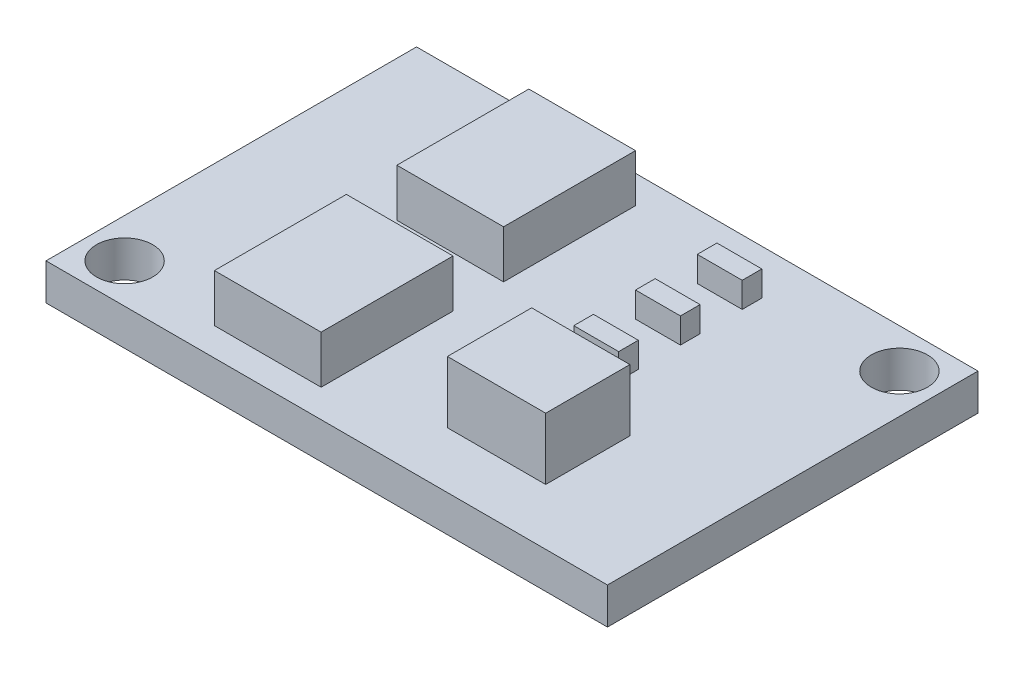
ISO-10303-21;
HEADER;
FILE_DESCRIPTION(('STEP AP214'),'2;1');
FILE_NAME('part.step','',(''),(''),'','','');
FILE_SCHEMA(('AUTOMOTIVE_DESIGN { 1 0 10303 214 1 1 1 1 }'));
ENDSEC;
DATA;
#1=APPLICATION_CONTEXT('core data for automotive mechanical design processes');
#2=APPLICATION_PROTOCOL_DEFINITION('international standard','automotive_design',2000,#1);
#3=PRODUCT_CONTEXT('',#1,'mechanical');
#4=PRODUCT('Part','Part','',(#3));
#5=PRODUCT_RELATED_PRODUCT_CATEGORY('part','',(#4));
#6=PRODUCT_DEFINITION_FORMATION('','',#4);
#7=PRODUCT_DEFINITION_CONTEXT('part definition',#1,'design');
#8=PRODUCT_DEFINITION('design','',#6,#7);
#9=PRODUCT_DEFINITION_SHAPE('','',#8);
#10=(LENGTH_UNIT() NAMED_UNIT(*) SI_UNIT(.MILLI.,.METRE.));
#11=(NAMED_UNIT(*) PLANE_ANGLE_UNIT() SI_UNIT($,.RADIAN.));
#12=(NAMED_UNIT(*) SI_UNIT($,.STERADIAN.) SOLID_ANGLE_UNIT());
#13=UNCERTAINTY_MEASURE_WITH_UNIT(LENGTH_MEASURE(1.E-05),#10,'distance_accuracy_value','');
#14=(GEOMETRIC_REPRESENTATION_CONTEXT(3) GLOBAL_UNCERTAINTY_ASSIGNED_CONTEXT((#13)) GLOBAL_UNIT_ASSIGNED_CONTEXT((#10,
#11,#12)) REPRESENTATION_CONTEXT('',''));
#15=CARTESIAN_POINT('',(0.,0.,0.));
#16=DIRECTION('',(0.,0.,1.));
#17=DIRECTION('',(1.,0.,0.));
#18=AXIS2_PLACEMENT_3D('',#15,#16,#17);
#19=CARTESIAN_POINT('',(0.,1.3,0.));
#20=DIRECTION('',(0.,1.,0.));
#21=DIRECTION('',(0.,0.,1.));
#22=AXIS2_PLACEMENT_3D('',#19,#20,#21);
#23=PLANE('',#22);
#24=DIRECTION('',(-1.,0.,0.));
#25=VECTOR('',#24,1.);
#26=CARTESIAN_POINT('',(0.,1.3,0.900000000000002));
#27=LINE('',#26,#25);
#28=CARTESIAN_POINT('',(-1.2,1.3,0.900000000000002));
#29=VERTEX_POINT('',#28);
#30=CARTESIAN_POINT('',(-5.,1.3,0.900000000000001));
#31=VERTEX_POINT('',#30);
#32=EDGE_CURVE('E408',#29,#31,#27,.T.);
#33=ORIENTED_EDGE('',*,*,#32,.F.);
#34=DIRECTION('',(0.,0.,-1.));
#35=VECTOR('',#34,1.);
#36=CARTESIAN_POINT('',(-1.2,1.3,0.));
#37=LINE('',#36,#35);
#38=CARTESIAN_POINT('',(-1.2,1.3,5.6));
#39=VERTEX_POINT('',#38);
#40=EDGE_CURVE('E401',#39,#29,#37,.T.);
#41=ORIENTED_EDGE('',*,*,#40,.F.);
#42=DIRECTION('',(-1.,0.,0.));
#43=VECTOR('',#42,1.);
#44=CARTESIAN_POINT('',(0.,1.3,5.6));
#45=LINE('',#44,#43);
#46=CARTESIAN_POINT('',(-5.,1.3,5.6));
#47=VERTEX_POINT('',#46);
#48=EDGE_CURVE('E404',#39,#47,#45,.T.);
#49=ORIENTED_EDGE('',*,*,#48,.T.);
#50=DIRECTION('',(0.,0.,-1.));
#51=VECTOR('',#50,1.);
#52=CARTESIAN_POINT('',(-5.,1.3,0.));
#53=LINE('',#52,#51);
#54=EDGE_CURVE('E406',#47,#31,#53,.T.);
#55=ORIENTED_EDGE('',*,*,#54,.T.);
#56=EDGE_LOOP('',(#33,#41,#49,#55));
#57=FACE_BOUND('',#56,.T.);
#58=DIRECTION('',(-1.,0.,0.));
#59=VECTOR('',#58,1.);
#60=CARTESIAN_POINT('',(0.,1.3,-5.6));
#61=LINE('',#60,#59);
#62=CARTESIAN_POINT('',(-1.2,1.3,-5.6));
#63=VERTEX_POINT('',#62);
#64=CARTESIAN_POINT('',(-5.,1.3,-5.6));
#65=VERTEX_POINT('',#64);
#66=EDGE_CURVE('E440',#63,#65,#61,.T.);
#67=ORIENTED_EDGE('',*,*,#66,.F.);
#68=DIRECTION('',(0.,0.,-1.));
#69=VECTOR('',#68,1.);
#70=CARTESIAN_POINT('',(-1.2,1.3,0.));
#71=LINE('',#70,#69);
#72=CARTESIAN_POINT('',(-1.2,1.3,-0.899999999999998));
#73=VERTEX_POINT('',#72);
#74=EDGE_CURVE('E425',#73,#63,#71,.T.);
#75=ORIENTED_EDGE('',*,*,#74,.F.);
#76=DIRECTION('',(-1.,0.,0.));
#77=VECTOR('',#76,1.);
#78=CARTESIAN_POINT('',(0.,1.3,-0.899999999999998));
#79=LINE('',#78,#77);
#80=CARTESIAN_POINT('',(-5.,1.3,-0.899999999999998));
#81=VERTEX_POINT('',#80);
#82=EDGE_CURVE('E436',#73,#81,#79,.T.);
#83=ORIENTED_EDGE('',*,*,#82,.T.);
#84=DIRECTION('',(0.,0.,-1.));
#85=VECTOR('',#84,1.);
#86=CARTESIAN_POINT('',(-5.,1.3,0.));
#87=LINE('',#86,#85);
#88=EDGE_CURVE('E438',#81,#65,#87,.T.);
#89=ORIENTED_EDGE('',*,*,#88,.T.);
#90=EDGE_LOOP('',(#67,#75,#83,#89));
#91=FACE_BOUND('',#90,.T.);
#92=CARTESIAN_POINT('',(8.6,1.3,-5.2));
#93=DIRECTION('',(0.,1.,0.));
#94=DIRECTION('',(0.,0.,1.));
#95=AXIS2_PLACEMENT_3D('',#92,#93,#94);
#96=CIRCLE('',#95,0.999999999999998);
#97=CARTESIAN_POINT('',(8.6,1.3,-4.2));
#98=VERTEX_POINT('',#97);
#99=EDGE_CURVE('E450',#98,#98,#96,.T.);
#100=ORIENTED_EDGE('',*,*,#99,.F.);
#101=EDGE_LOOP('',(#100));
#102=FACE_BOUND('',#101,.T.);
#103=DIRECTION('',(0.,0.,1.));
#104=VECTOR('',#103,1.);
#105=CARTESIAN_POINT('',(-10.,1.3,-6.6));
#106=LINE('',#105,#104);
#107=CARTESIAN_POINT('',(-10.,1.3,-6.6));
#108=VERTEX_POINT('',#107);
#109=CARTESIAN_POINT('',(-10.,1.3,6.6));
#110=VERTEX_POINT('',#109);
#111=EDGE_CURVE('E456',#108,#110,#106,.T.);
#112=ORIENTED_EDGE('',*,*,#111,.T.);
#113=DIRECTION('',(1.,0.,0.));
#114=VECTOR('',#113,1.);
#115=CARTESIAN_POINT('',(-10.,1.3,6.6));
#116=LINE('',#115,#114);
#117=CARTESIAN_POINT('',(10.,1.3,6.6));
#118=VERTEX_POINT('',#117);
#119=EDGE_CURVE('E459',#110,#118,#116,.T.);
#120=ORIENTED_EDGE('',*,*,#119,.T.);
#121=DIRECTION('',(0.,0.,1.));
#122=VECTOR('',#121,1.);
#123=CARTESIAN_POINT('',(10.,1.3,-6.6));
#124=LINE('',#123,#122);
#125=CARTESIAN_POINT('',(10.,1.3,-6.6));
#126=VERTEX_POINT('',#125);
#127=EDGE_CURVE('E462',#126,#118,#124,.T.);
#128=ORIENTED_EDGE('',*,*,#127,.F.);
#129=DIRECTION('',(1.,0.,0.));
#130=VECTOR('',#129,1.);
#131=CARTESIAN_POINT('',(-10.,1.3,-6.6));
#132=LINE('',#131,#130);
#133=EDGE_CURVE('E465',#108,#126,#132,.T.);
#134=ORIENTED_EDGE('',*,*,#133,.F.);
#135=EDGE_LOOP('',(#112,#120,#128,#134));
#136=FACE_BOUND('',#135,.T.);
#137=CARTESIAN_POINT('',(-8.6,1.3,5.2));
#138=DIRECTION('',(0.,1.,0.));
#139=DIRECTION('',(0.,0.,1.));
#140=AXIS2_PLACEMENT_3D('',#137,#138,#139);
#141=CIRCLE('',#140,0.999999999999998);
#142=CARTESIAN_POINT('',(-8.6,1.3,6.2));
#143=VERTEX_POINT('',#142);
#144=EDGE_CURVE('E444',#143,#143,#141,.T.);
#145=ORIENTED_EDGE('',*,*,#144,.F.);
#146=EDGE_LOOP('',(#145));
#147=FACE_BOUND('',#146,.T.);
#148=DIRECTION('',(-1.,0.,0.));
#149=VECTOR('',#148,1.);
#150=CARTESIAN_POINT('',(0.,1.3,-4.3));
#151=LINE('',#150,#149);
#152=CARTESIAN_POINT('',(3.9,1.3,-4.3));
#153=VERTEX_POINT('',#152);
#154=CARTESIAN_POINT('',(2.3,1.3,-4.3));
#155=VERTEX_POINT('',#154);
#156=EDGE_CURVE('E375',#153,#155,#151,.T.);
#157=ORIENTED_EDGE('',*,*,#156,.T.);
#158=DIRECTION('',(0.,0.,-1.));
#159=VECTOR('',#158,1.);
#160=CARTESIAN_POINT('',(2.3,1.3,0.));
#161=LINE('',#160,#159);
#162=CARTESIAN_POINT('',(2.3,1.3,-5.));
#163=VERTEX_POINT('',#162);
#164=EDGE_CURVE('E377',#155,#163,#161,.T.);
#165=ORIENTED_EDGE('',*,*,#164,.T.);
#166=DIRECTION('',(-1.,0.,0.));
#167=VECTOR('',#166,1.);
#168=CARTESIAN_POINT('',(0.,1.3,-5.));
#169=LINE('',#168,#167);
#170=CARTESIAN_POINT('',(3.9,1.3,-5.));
#171=VERTEX_POINT('',#170);
#172=EDGE_CURVE('E369',#171,#163,#169,.T.);
#173=ORIENTED_EDGE('',*,*,#172,.F.);
#174=DIRECTION('',(0.,0.,-1.));
#175=VECTOR('',#174,1.);
#176=CARTESIAN_POINT('',(3.9,1.3,0.));
#177=LINE('',#176,#175);
#178=EDGE_CURVE('E372',#153,#171,#177,.T.);
#179=ORIENTED_EDGE('',*,*,#178,.F.);
#180=EDGE_LOOP('',(#157,#165,#173,#179));
#181=FACE_BOUND('',#180,.T.);
#182=DIRECTION('',(-1.,0.,0.));
#183=VECTOR('',#182,1.);
#184=CARTESIAN_POINT('',(0.,1.3,-2.1));
#185=LINE('',#184,#183);
#186=CARTESIAN_POINT('',(3.9,1.3,-2.1));
#187=VERTEX_POINT('',#186);
#188=CARTESIAN_POINT('',(2.3,1.3,-2.1));
#189=VERTEX_POINT('',#188);
#190=EDGE_CURVE('E342',#187,#189,#185,.T.);
#191=ORIENTED_EDGE('',*,*,#190,.T.);
#192=DIRECTION('',(0.,0.,-1.));
#193=VECTOR('',#192,1.);
#194=CARTESIAN_POINT('',(2.3,1.3,0.));
#195=LINE('',#194,#193);
#196=CARTESIAN_POINT('',(2.3,1.3,-2.8));
#197=VERTEX_POINT('',#196);
#198=EDGE_CURVE('E344',#189,#197,#195,.T.);
#199=ORIENTED_EDGE('',*,*,#198,.T.);
#200=DIRECTION('',(-1.,0.,0.));
#201=VECTOR('',#200,1.);
#202=CARTESIAN_POINT('',(0.,1.3,-2.8));
#203=LINE('',#202,#201);
#204=CARTESIAN_POINT('',(3.9,1.3,-2.8));
#205=VERTEX_POINT('',#204);
#206=EDGE_CURVE('E336',#205,#197,#203,.T.);
#207=ORIENTED_EDGE('',*,*,#206,.F.);
#208=DIRECTION('',(0.,0.,-1.));
#209=VECTOR('',#208,1.);
#210=CARTESIAN_POINT('',(3.9,1.3,0.));
#211=LINE('',#210,#209);
#212=EDGE_CURVE('E339',#187,#205,#211,.T.);
#213=ORIENTED_EDGE('',*,*,#212,.F.);
#214=EDGE_LOOP('',(#191,#199,#207,#213));
#215=FACE_BOUND('',#214,.T.);
#216=DIRECTION('',(-1.,0.,0.));
#217=VECTOR('',#216,1.);
#218=CARTESIAN_POINT('',(0.,1.3,0.100000000000001));
#219=LINE('',#218,#217);
#220=CARTESIAN_POINT('',(3.9,1.3,0.100000000000002));
#221=VERTEX_POINT('',#220);
#222=CARTESIAN_POINT('',(2.3,1.3,0.100000000000002));
#223=VERTEX_POINT('',#222);
#224=EDGE_CURVE('E309',#221,#223,#219,.T.);
#225=ORIENTED_EDGE('',*,*,#224,.T.);
#226=DIRECTION('',(0.,0.,-1.));
#227=VECTOR('',#226,1.);
#228=CARTESIAN_POINT('',(2.3,1.3,0.));
#229=LINE('',#228,#227);
#230=CARTESIAN_POINT('',(2.3,1.3,-0.599999999999998));
#231=VERTEX_POINT('',#230);
#232=EDGE_CURVE('E311',#223,#231,#229,.T.);
#233=ORIENTED_EDGE('',*,*,#232,.T.);
#234=DIRECTION('',(-1.,0.,0.));
#235=VECTOR('',#234,1.);
#236=CARTESIAN_POINT('',(0.,1.3,-0.599999999999998));
#237=LINE('',#236,#235);
#238=CARTESIAN_POINT('',(3.9,1.3,-0.599999999999998));
#239=VERTEX_POINT('',#238);
#240=EDGE_CURVE('E303',#239,#231,#237,.T.);
#241=ORIENTED_EDGE('',*,*,#240,.F.);
#242=DIRECTION('',(0.,0.,-1.));
#243=VECTOR('',#242,1.);
#244=CARTESIAN_POINT('',(3.9,1.3,0.));
#245=LINE('',#244,#243);
#246=EDGE_CURVE('E306',#221,#239,#245,.T.);
#247=ORIENTED_EDGE('',*,*,#246,.F.);
#248=EDGE_LOOP('',(#225,#233,#241,#247));
#249=FACE_BOUND('',#248,.T.);
#250=DIRECTION('',(-1.,0.,0.));
#251=VECTOR('',#250,1.);
#252=CARTESIAN_POINT('',(0.,1.3,4.6));
#253=LINE('',#252,#251);
#254=CARTESIAN_POINT('',(5.8,1.3,4.6));
#255=VERTEX_POINT('',#254);
#256=CARTESIAN_POINT('',(2.3,1.3,4.6));
#257=VERTEX_POINT('',#256);
#258=EDGE_CURVE('E78',#255,#257,#253,.T.);
#259=ORIENTED_EDGE('',*,*,#258,.T.);
#260=DIRECTION('',(0.,0.,-1.));
#261=VECTOR('',#260,1.);
#262=CARTESIAN_POINT('',(2.3,1.3,0.));
#263=LINE('',#262,#261);
#264=CARTESIAN_POINT('',(2.3,1.3,1.6));
#265=VERTEX_POINT('',#264);
#266=EDGE_CURVE('E268',#257,#265,#263,.T.);
#267=ORIENTED_EDGE('',*,*,#266,.T.);
#268=DIRECTION('',(-1.,0.,0.));
#269=VECTOR('',#268,1.);
#270=CARTESIAN_POINT('',(0.,1.3,1.6));
#271=LINE('',#270,#269);
#272=CARTESIAN_POINT('',(5.8,1.3,1.6));
#273=VERTEX_POINT('',#272);
#274=EDGE_CURVE('E269',#273,#265,#271,.T.);
#275=ORIENTED_EDGE('',*,*,#274,.F.);
#276=DIRECTION('',(0.,0.,-1.));
#277=VECTOR('',#276,1.);
#278=CARTESIAN_POINT('',(5.8,1.3,0.));
#279=LINE('',#278,#277);
#280=EDGE_CURVE('E83',#255,#273,#279,.T.);
#281=ORIENTED_EDGE('',*,*,#280,.F.);
#282=EDGE_LOOP('',(#259,#267,#275,#281));
#283=FACE_BOUND('',#282,.T.);
#284=ADVANCED_FACE('F63',(#57,#91,#102,#136,#147,#181,#215,#249,#283),#23,.T.);
#285=CARTESIAN_POINT('',(0.,0.,0.));
#286=DIRECTION('',(0.,1.,0.));
#287=DIRECTION('',(0.,0.,1.));
#288=AXIS2_PLACEMENT_3D('',#285,#286,#287);
#289=PLANE('',#288);
#290=DIRECTION('',(0.,0.,1.));
#291=VECTOR('',#290,1.);
#292=CARTESIAN_POINT('',(-10.,0.,-6.6));
#293=LINE('',#292,#291);
#294=CARTESIAN_POINT('',(-10.,0.,-6.6));
#295=VERTEX_POINT('',#294);
#296=CARTESIAN_POINT('',(-10.,0.,6.6));
#297=VERTEX_POINT('',#296);
#298=EDGE_CURVE('E453',#295,#297,#293,.T.);
#299=ORIENTED_EDGE('',*,*,#298,.F.);
#300=DIRECTION('',(1.,0.,0.));
#301=VECTOR('',#300,1.);
#302=CARTESIAN_POINT('',(-10.,0.,-6.6));
#303=LINE('',#302,#301);
#304=CARTESIAN_POINT('',(10.,0.,-6.6));
#305=VERTEX_POINT('',#304);
#306=EDGE_CURVE('E460',#295,#305,#303,.T.);
#307=ORIENTED_EDGE('',*,*,#306,.T.);
#308=DIRECTION('',(0.,0.,1.));
#309=VECTOR('',#308,1.);
#310=CARTESIAN_POINT('',(10.,0.,-6.6));
#311=LINE('',#310,#309);
#312=CARTESIAN_POINT('',(10.,0.,6.6));
#313=VERTEX_POINT('',#312);
#314=EDGE_CURVE('E474',#305,#313,#311,.T.);
#315=ORIENTED_EDGE('',*,*,#314,.T.);
#316=DIRECTION('',(1.,0.,0.));
#317=VECTOR('',#316,1.);
#318=CARTESIAN_POINT('',(-10.,0.,6.6));
#319=LINE('',#318,#317);
#320=EDGE_CURVE('E471',#297,#313,#319,.T.);
#321=ORIENTED_EDGE('',*,*,#320,.F.);
#322=EDGE_LOOP('',(#299,#307,#315,#321));
#323=FACE_BOUND('',#322,.T.);
#324=CARTESIAN_POINT('',(8.6,0.,-5.2));
#325=DIRECTION('',(0.,1.,0.));
#326=DIRECTION('',(0.,0.,1.));
#327=AXIS2_PLACEMENT_3D('',#324,#325,#326);
#328=CIRCLE('',#327,0.999999999999998);
#329=CARTESIAN_POINT('',(8.6,0.,-4.2));
#330=VERTEX_POINT('',#329);
#331=EDGE_CURVE('E447',#330,#330,#328,.T.);
#332=ORIENTED_EDGE('',*,*,#331,.T.);
#333=EDGE_LOOP('',(#332));
#334=FACE_BOUND('',#333,.T.);
#335=CARTESIAN_POINT('',(-8.6,0.,5.2));
#336=DIRECTION('',(0.,1.,0.));
#337=DIRECTION('',(0.,0.,1.));
#338=AXIS2_PLACEMENT_3D('',#335,#336,#337);
#339=CIRCLE('',#338,0.999999999999998);
#340=CARTESIAN_POINT('',(-8.6,0.,6.2));
#341=VERTEX_POINT('',#340);
#342=EDGE_CURVE('E443',#341,#341,#339,.T.);
#343=ORIENTED_EDGE('',*,*,#342,.T.);
#344=EDGE_LOOP('',(#343));
#345=FACE_BOUND('',#344,.T.);
#346=ADVANCED_FACE('F491',(#323,#334,#345),#289,.F.);
#347=CARTESIAN_POINT('',(-10.,1.3,-6.6));
#348=DIRECTION('',(1.,0.,0.));
#349=DIRECTION('',(0.,0.,-1.));
#350=AXIS2_PLACEMENT_3D('',#347,#348,#349);
#351=PLANE('',#350);
#352=ORIENTED_EDGE('',*,*,#298,.T.);
#353=DIRECTION('',(0.,-1.,0.));
#354=VECTOR('',#353,1.);
#355=CARTESIAN_POINT('',(-10.,1.3,6.6));
#356=LINE('',#355,#354);
#357=EDGE_CURVE('E12',#110,#297,#356,.T.);
#358=ORIENTED_EDGE('',*,*,#357,.F.);
#359=ORIENTED_EDGE('',*,*,#111,.F.);
#360=DIRECTION('',(0.,-1.,0.));
#361=VECTOR('',#360,1.);
#362=CARTESIAN_POINT('',(-10.,1.3,-6.6));
#363=LINE('',#362,#361);
#364=EDGE_CURVE('E468',#108,#295,#363,.T.);
#365=ORIENTED_EDGE('',*,*,#364,.T.);
#366=EDGE_LOOP('',(#352,#358,#359,#365));
#367=FACE_BOUND('',#366,.T.);
#368=ADVANCED_FACE('F65',(#367),#351,.F.);
#369=CARTESIAN_POINT('',(-10.,1.3,6.6));
#370=DIRECTION('',(0.,0.,-1.));
#371=DIRECTION('',(-1.,0.,0.));
#372=AXIS2_PLACEMENT_3D('',#369,#370,#371);
#373=PLANE('',#372);
#374=ORIENTED_EDGE('',*,*,#320,.T.);
#375=DIRECTION('',(0.,-1.,0.));
#376=VECTOR('',#375,1.);
#377=CARTESIAN_POINT('',(10.,1.3,6.6));
#378=LINE('',#377,#376);
#379=EDGE_CURVE('E71',#118,#313,#378,.T.);
#380=ORIENTED_EDGE('',*,*,#379,.F.);
#381=ORIENTED_EDGE('',*,*,#119,.F.);
#382=ORIENTED_EDGE('',*,*,#357,.T.);
#383=EDGE_LOOP('',(#374,#380,#381,#382));
#384=FACE_BOUND('',#383,.T.);
#385=ADVANCED_FACE('F487',(#384),#373,.F.);
#386=CARTESIAN_POINT('',(10.,1.3,-6.6));
#387=DIRECTION('',(1.,0.,0.));
#388=DIRECTION('',(0.,0.,-1.));
#389=AXIS2_PLACEMENT_3D('',#386,#387,#388);
#390=PLANE('',#389);
#391=ORIENTED_EDGE('',*,*,#314,.F.);
#392=DIRECTION('',(0.,-1.,0.));
#393=VECTOR('',#392,1.);
#394=CARTESIAN_POINT('',(10.,1.3,-6.6));
#395=LINE('',#394,#393);
#396=EDGE_CURVE('E480',#126,#305,#395,.T.);
#397=ORIENTED_EDGE('',*,*,#396,.F.);
#398=ORIENTED_EDGE('',*,*,#127,.T.);
#399=ORIENTED_EDGE('',*,*,#379,.T.);
#400=EDGE_LOOP('',(#391,#397,#398,#399));
#401=FACE_BOUND('',#400,.T.);
#402=ADVANCED_FACE('F484',(#401),#390,.T.);
#403=CARTESIAN_POINT('',(-10.,1.3,-6.6));
#404=DIRECTION('',(0.,0.,-1.));
#405=DIRECTION('',(-1.,0.,0.));
#406=AXIS2_PLACEMENT_3D('',#403,#404,#405);
#407=PLANE('',#406);
#408=ORIENTED_EDGE('',*,*,#306,.F.);
#409=ORIENTED_EDGE('',*,*,#364,.F.);
#410=ORIENTED_EDGE('',*,*,#133,.T.);
#411=ORIENTED_EDGE('',*,*,#396,.T.);
#412=EDGE_LOOP('',(#408,#409,#410,#411));
#413=FACE_BOUND('',#412,.T.);
#414=ADVANCED_FACE('F495',(#413),#407,.T.);
#415=CARTESIAN_POINT('',(8.6,1.3,-5.2));
#416=DIRECTION('',(0.,-1.,0.));
#417=DIRECTION('',(0.,0.,-1.));
#418=AXIS2_PLACEMENT_3D('',#415,#416,#417);
#419=CYLINDRICAL_SURFACE('',#418,0.999999999999998);
#420=ORIENTED_EDGE('',*,*,#99,.T.);
#421=EDGE_LOOP('',(#420));
#422=FACE_BOUND('',#421,.T.);
#423=ORIENTED_EDGE('',*,*,#331,.F.);
#424=EDGE_LOOP('',(#423));
#425=FACE_BOUND('',#424,.T.);
#426=ADVANCED_FACE('F514',(#422,#425),#419,.F.);
#427=CARTESIAN_POINT('',(-8.6,1.3,5.2));
#428=DIRECTION('',(0.,-1.,0.));
#429=DIRECTION('',(0.,0.,-1.));
#430=AXIS2_PLACEMENT_3D('',#427,#428,#429);
#431=CYLINDRICAL_SURFACE('',#430,0.999999999999998);
#432=ORIENTED_EDGE('',*,*,#144,.T.);
#433=EDGE_LOOP('',(#432));
#434=FACE_BOUND('',#433,.T.);
#435=ORIENTED_EDGE('',*,*,#342,.F.);
#436=EDGE_LOOP('',(#435));
#437=FACE_BOUND('',#436,.T.);
#438=ADVANCED_FACE('F534',(#434,#437),#431,.F.);
#439=CARTESIAN_POINT('',(-5.,3.,-5.6));
#440=DIRECTION('',(0.,0.,-1.));
#441=DIRECTION('',(-1.,0.,0.));
#442=AXIS2_PLACEMENT_3D('',#439,#440,#441);
#443=PLANE('',#442);
#444=DIRECTION('',(0.,-1.,0.));
#445=VECTOR('',#444,1.);
#446=CARTESIAN_POINT('',(-1.2,3.,-5.6));
#447=LINE('',#446,#445);
#448=CARTESIAN_POINT('',(-1.2,3.,-5.6));
#449=VERTEX_POINT('',#448);
#450=EDGE_CURVE('E421',#449,#63,#447,.T.);
#451=ORIENTED_EDGE('',*,*,#450,.T.);
#452=ORIENTED_EDGE('',*,*,#66,.T.);
#453=DIRECTION('',(0.,-1.,0.));
#454=VECTOR('',#453,1.);
#455=CARTESIAN_POINT('',(-5.,3.,-5.6));
#456=LINE('',#455,#454);
#457=CARTESIAN_POINT('',(-5.,3.,-5.6));
#458=VERTEX_POINT('',#457);
#459=EDGE_CURVE('E422',#458,#65,#456,.T.);
#460=ORIENTED_EDGE('',*,*,#459,.F.);
#461=DIRECTION('',(1.,0.,0.));
#462=VECTOR('',#461,1.);
#463=CARTESIAN_POINT('',(-5.,3.,-5.6));
#464=LINE('',#463,#462);
#465=EDGE_CURVE('E411',#458,#449,#464,.T.);
#466=ORIENTED_EDGE('',*,*,#465,.T.);
#467=EDGE_LOOP('',(#451,#452,#460,#466));
#468=FACE_BOUND('',#467,.T.);
#469=ADVANCED_FACE('F541',(#468),#443,.T.);
#470=CARTESIAN_POINT('',(-5.,3.,-5.6));
#471=DIRECTION('',(1.,0.,0.));
#472=DIRECTION('',(0.,0.,-1.));
#473=AXIS2_PLACEMENT_3D('',#470,#471,#472);
#474=PLANE('',#473);
#475=ORIENTED_EDGE('',*,*,#88,.F.);
#476=DIRECTION('',(0.,-1.,0.));
#477=VECTOR('',#476,1.);
#478=CARTESIAN_POINT('',(-5.,3.,-0.899999999999998));
#479=LINE('',#478,#477);
#480=CARTESIAN_POINT('',(-5.,3.,-0.899999999999998));
#481=VERTEX_POINT('',#480);
#482=EDGE_CURVE('E426',#481,#81,#479,.T.);
#483=ORIENTED_EDGE('',*,*,#482,.F.);
#484=DIRECTION('',(0.,0.,1.));
#485=VECTOR('',#484,1.);
#486=CARTESIAN_POINT('',(-5.,3.,-5.6));
#487=LINE('',#486,#485);
#488=EDGE_CURVE('E419',#458,#481,#487,.T.);
#489=ORIENTED_EDGE('',*,*,#488,.F.);
#490=ORIENTED_EDGE('',*,*,#459,.T.);
#491=EDGE_LOOP('',(#475,#483,#489,#490));
#492=FACE_BOUND('',#491,.T.);
#493=ADVANCED_FACE('F548',(#492),#474,.F.);
#494=CARTESIAN_POINT('',(-5.,3.,-0.899999999999998));
#495=DIRECTION('',(0.,0.,-1.));
#496=DIRECTION('',(-1.,0.,0.));
#497=AXIS2_PLACEMENT_3D('',#494,#495,#496);
#498=PLANE('',#497);
#499=ORIENTED_EDGE('',*,*,#82,.F.);
#500=DIRECTION('',(0.,-1.,0.));
#501=VECTOR('',#500,1.);
#502=CARTESIAN_POINT('',(-1.2,3.,-0.899999999999998));
#503=LINE('',#502,#501);
#504=CARTESIAN_POINT('',(-1.2,3.,-0.899999999999998));
#505=VERTEX_POINT('',#504);
#506=EDGE_CURVE('E429',#505,#73,#503,.T.);
#507=ORIENTED_EDGE('',*,*,#506,.F.);
#508=DIRECTION('',(1.,0.,0.));
#509=VECTOR('',#508,1.);
#510=CARTESIAN_POINT('',(-5.,3.,-0.899999999999998));
#511=LINE('',#510,#509);
#512=EDGE_CURVE('E417',#481,#505,#511,.T.);
#513=ORIENTED_EDGE('',*,*,#512,.F.);
#514=ORIENTED_EDGE('',*,*,#482,.T.);
#515=EDGE_LOOP('',(#499,#507,#513,#514));
#516=FACE_BOUND('',#515,.T.);
#517=ADVANCED_FACE('F556',(#516),#498,.F.);
#518=CARTESIAN_POINT('',(-1.2,3.,-5.6));
#519=DIRECTION('',(1.,0.,0.));
#520=DIRECTION('',(0.,0.,-1.));
#521=AXIS2_PLACEMENT_3D('',#518,#519,#520);
#522=PLANE('',#521);
#523=ORIENTED_EDGE('',*,*,#506,.T.);
#524=ORIENTED_EDGE('',*,*,#74,.T.);
#525=ORIENTED_EDGE('',*,*,#450,.F.);
#526=DIRECTION('',(0.,0.,1.));
#527=VECTOR('',#526,1.);
#528=CARTESIAN_POINT('',(-1.2,3.,-5.6));
#529=LINE('',#528,#527);
#530=EDGE_CURVE('E414',#449,#505,#529,.T.);
#531=ORIENTED_EDGE('',*,*,#530,.T.);
#532=EDGE_LOOP('',(#523,#524,#525,#531));
#533=FACE_BOUND('',#532,.T.);
#534=ADVANCED_FACE('F564',(#533),#522,.T.);
#535=CARTESIAN_POINT('',(0.,3.,0.));
#536=DIRECTION('',(0.,-1.,0.));
#537=DIRECTION('',(0.,0.,-1.));
#538=AXIS2_PLACEMENT_3D('',#535,#536,#537);
#539=PLANE('',#538);
#540=ORIENTED_EDGE('',*,*,#465,.F.);
#541=ORIENTED_EDGE('',*,*,#488,.T.);
#542=ORIENTED_EDGE('',*,*,#512,.T.);
#543=ORIENTED_EDGE('',*,*,#530,.F.);
#544=EDGE_LOOP('',(#540,#541,#542,#543));
#545=FACE_BOUND('',#544,.T.);
#546=ADVANCED_FACE('F572',(#545),#539,.F.);
#547=CARTESIAN_POINT('',(-5.,3.,0.900000000000001));
#548=DIRECTION('',(0.,0.,-1.));
#549=DIRECTION('',(-1.,0.,0.));
#550=AXIS2_PLACEMENT_3D('',#547,#548,#549);
#551=PLANE('',#550);
#552=DIRECTION('',(0.,-1.,0.));
#553=VECTOR('',#552,1.);
#554=CARTESIAN_POINT('',(-1.2,3.,0.900000000000002));
#555=LINE('',#554,#553);
#556=CARTESIAN_POINT('',(-1.2,3.,0.900000000000002));
#557=VERTEX_POINT('',#556);
#558=EDGE_CURVE('E380',#557,#29,#555,.T.);
#559=ORIENTED_EDGE('',*,*,#558,.T.);
#560=ORIENTED_EDGE('',*,*,#32,.T.);
#561=DIRECTION('',(0.,-1.,0.));
#562=VECTOR('',#561,1.);
#563=CARTESIAN_POINT('',(-5.,3.,0.900000000000001));
#564=LINE('',#563,#562);
#565=CARTESIAN_POINT('',(-5.,3.,0.900000000000001));
#566=VERTEX_POINT('',#565);
#567=EDGE_CURVE('E379',#566,#31,#564,.T.);
#568=ORIENTED_EDGE('',*,*,#567,.F.);
#569=DIRECTION('',(1.,0.,0.));
#570=VECTOR('',#569,1.);
#571=CARTESIAN_POINT('',(-5.,3.,0.900000000000001));
#572=LINE('',#571,#570);
#573=EDGE_CURVE('E398',#566,#557,#572,.T.);
#574=ORIENTED_EDGE('',*,*,#573,.T.);
#575=EDGE_LOOP('',(#559,#560,#568,#574));
#576=FACE_BOUND('',#575,.T.);
#577=ADVANCED_FACE('F580',(#576),#551,.T.);
#578=CARTESIAN_POINT('',(-5.,3.,0.900000000000001));
#579=DIRECTION('',(1.,0.,0.));
#580=DIRECTION('',(0.,0.,-1.));
#581=AXIS2_PLACEMENT_3D('',#578,#579,#580);
#582=PLANE('',#581);
#583=ORIENTED_EDGE('',*,*,#54,.F.);
#584=DIRECTION('',(0.,-1.,0.));
#585=VECTOR('',#584,1.);
#586=CARTESIAN_POINT('',(-5.,3.,5.6));
#587=LINE('',#586,#585);
#588=CARTESIAN_POINT('',(-5.,3.,5.6));
#589=VERTEX_POINT('',#588);
#590=EDGE_CURVE('E387',#589,#47,#587,.T.);
#591=ORIENTED_EDGE('',*,*,#590,.F.);
#592=DIRECTION('',(0.,0.,1.));
#593=VECTOR('',#592,1.);
#594=CARTESIAN_POINT('',(-5.,3.,0.900000000000001));
#595=LINE('',#594,#593);
#596=EDGE_CURVE('E383',#566,#589,#595,.T.);
#597=ORIENTED_EDGE('',*,*,#596,.F.);
#598=ORIENTED_EDGE('',*,*,#567,.T.);
#599=EDGE_LOOP('',(#583,#591,#597,#598));
#600=FACE_BOUND('',#599,.T.);
#601=ADVANCED_FACE('F588',(#600),#582,.F.);
#602=CARTESIAN_POINT('',(-5.,3.,5.6));
#603=DIRECTION('',(0.,0.,-1.));
#604=DIRECTION('',(-1.,0.,0.));
#605=AXIS2_PLACEMENT_3D('',#602,#603,#604);
#606=PLANE('',#605);
#607=ORIENTED_EDGE('',*,*,#48,.F.);
#608=DIRECTION('',(0.,-1.,0.));
#609=VECTOR('',#608,1.);
#610=CARTESIAN_POINT('',(-1.2,3.,5.6));
#611=LINE('',#610,#609);
#612=CARTESIAN_POINT('',(-1.2,3.,5.6));
#613=VERTEX_POINT('',#612);
#614=EDGE_CURVE('E384',#613,#39,#611,.T.);
#615=ORIENTED_EDGE('',*,*,#614,.F.);
#616=DIRECTION('',(1.,0.,0.));
#617=VECTOR('',#616,1.);
#618=CARTESIAN_POINT('',(-5.,3.,5.6));
#619=LINE('',#618,#617);
#620=EDGE_CURVE('E393',#589,#613,#619,.T.);
#621=ORIENTED_EDGE('',*,*,#620,.F.);
#622=ORIENTED_EDGE('',*,*,#590,.T.);
#623=EDGE_LOOP('',(#607,#615,#621,#622));
#624=FACE_BOUND('',#623,.T.);
#625=ADVANCED_FACE('F596',(#624),#606,.F.);
#626=CARTESIAN_POINT('',(-1.2,3.,0.900000000000002));
#627=DIRECTION('',(1.,0.,0.));
#628=DIRECTION('',(0.,0.,-1.));
#629=AXIS2_PLACEMENT_3D('',#626,#627,#628);
#630=PLANE('',#629);
#631=ORIENTED_EDGE('',*,*,#614,.T.);
#632=ORIENTED_EDGE('',*,*,#40,.T.);
#633=ORIENTED_EDGE('',*,*,#558,.F.);
#634=DIRECTION('',(0.,0.,1.));
#635=VECTOR('',#634,1.);
#636=CARTESIAN_POINT('',(-1.2,3.,0.900000000000002));
#637=LINE('',#636,#635);
#638=EDGE_CURVE('E395',#557,#613,#637,.T.);
#639=ORIENTED_EDGE('',*,*,#638,.T.);
#640=EDGE_LOOP('',(#631,#632,#633,#639));
#641=FACE_BOUND('',#640,.T.);
#642=ADVANCED_FACE('F604',(#641),#630,.T.);
#643=CARTESIAN_POINT('',(0.,3.,0.));
#644=DIRECTION('',(0.,-1.,0.));
#645=DIRECTION('',(0.,0.,-1.));
#646=AXIS2_PLACEMENT_3D('',#643,#644,#645);
#647=PLANE('',#646);
#648=ORIENTED_EDGE('',*,*,#573,.F.);
#649=ORIENTED_EDGE('',*,*,#596,.T.);
#650=ORIENTED_EDGE('',*,*,#620,.T.);
#651=ORIENTED_EDGE('',*,*,#638,.F.);
#652=EDGE_LOOP('',(#648,#649,#650,#651));
#653=FACE_BOUND('',#652,.T.);
#654=ADVANCED_FACE('F612',(#653),#647,.F.);
#655=CARTESIAN_POINT('',(2.3,2.2,-5.));
#656=DIRECTION('',(1.,0.,0.));
#657=DIRECTION('',(0.,0.,-1.));
#658=AXIS2_PLACEMENT_3D('',#655,#656,#657);
#659=PLANE('',#658);
#660=ORIENTED_EDGE('',*,*,#164,.F.);
#661=DIRECTION('',(0.,-1.,0.));
#662=VECTOR('',#661,1.);
#663=CARTESIAN_POINT('',(2.3,2.2,-4.3));
#664=LINE('',#663,#662);
#665=CARTESIAN_POINT('',(2.3,2.2,-4.3));
#666=VERTEX_POINT('',#665);
#667=EDGE_CURVE('E366',#666,#155,#664,.T.);
#668=ORIENTED_EDGE('',*,*,#667,.F.);
#669=DIRECTION('',(0.,0.,1.));
#670=VECTOR('',#669,1.);
#671=CARTESIAN_POINT('',(2.3,2.2,-5.));
#672=LINE('',#671,#670);
#673=CARTESIAN_POINT('',(2.3,2.2,-5.));
#674=VERTEX_POINT('',#673);
#675=EDGE_CURVE('E346',#674,#666,#672,.T.);
#676=ORIENTED_EDGE('',*,*,#675,.F.);
#677=DIRECTION('',(0.,-1.,0.));
#678=VECTOR('',#677,1.);
#679=CARTESIAN_POINT('',(2.3,2.2,-5.));
#680=LINE('',#679,#678);
#681=EDGE_CURVE('E357',#674,#163,#680,.T.);
#682=ORIENTED_EDGE('',*,*,#681,.T.);
#683=EDGE_LOOP('',(#660,#668,#676,#682));
#684=FACE_BOUND('',#683,.T.);
#685=ADVANCED_FACE('F620',(#684),#659,.F.);
#686=CARTESIAN_POINT('',(2.3,2.2,-4.3));
#687=DIRECTION('',(0.,0.,-1.));
#688=DIRECTION('',(-1.,0.,0.));
#689=AXIS2_PLACEMENT_3D('',#686,#687,#688);
#690=PLANE('',#689);
#691=ORIENTED_EDGE('',*,*,#156,.F.);
#692=DIRECTION('',(0.,-1.,0.));
#693=VECTOR('',#692,1.);
#694=CARTESIAN_POINT('',(3.9,2.2,-4.3));
#695=LINE('',#694,#693);
#696=CARTESIAN_POINT('',(3.9,2.2,-4.3));
#697=VERTEX_POINT('',#696);
#698=EDGE_CURVE('E363',#697,#153,#695,.T.);
#699=ORIENTED_EDGE('',*,*,#698,.F.);
#700=DIRECTION('',(1.,0.,0.));
#701=VECTOR('',#700,1.);
#702=CARTESIAN_POINT('',(2.3,2.2,-4.3));
#703=LINE('',#702,#701);
#704=EDGE_CURVE('E349',#666,#697,#703,.T.);
#705=ORIENTED_EDGE('',*,*,#704,.F.);
#706=ORIENTED_EDGE('',*,*,#667,.T.);
#707=EDGE_LOOP('',(#691,#699,#705,#706));
#708=FACE_BOUND('',#707,.T.);
#709=ADVANCED_FACE('F628',(#708),#690,.F.);
#710=CARTESIAN_POINT('',(3.9,2.2,-5.));
#711=DIRECTION('',(1.,0.,0.));
#712=DIRECTION('',(0.,0.,-1.));
#713=AXIS2_PLACEMENT_3D('',#710,#711,#712);
#714=PLANE('',#713);
#715=ORIENTED_EDGE('',*,*,#698,.T.);
#716=ORIENTED_EDGE('',*,*,#178,.T.);
#717=DIRECTION('',(0.,-1.,0.));
#718=VECTOR('',#717,1.);
#719=CARTESIAN_POINT('',(3.9,2.2,-5.));
#720=LINE('',#719,#718);
#721=CARTESIAN_POINT('',(3.9,2.2,-5.));
#722=VERTEX_POINT('',#721);
#723=EDGE_CURVE('E360',#722,#171,#720,.T.);
#724=ORIENTED_EDGE('',*,*,#723,.F.);
#725=DIRECTION('',(0.,0.,1.));
#726=VECTOR('',#725,1.);
#727=CARTESIAN_POINT('',(3.9,2.2,-5.));
#728=LINE('',#727,#726);
#729=EDGE_CURVE('E351',#722,#697,#728,.T.);
#730=ORIENTED_EDGE('',*,*,#729,.T.);
#731=EDGE_LOOP('',(#715,#716,#724,#730));
#732=FACE_BOUND('',#731,.T.);
#733=ADVANCED_FACE('F636',(#732),#714,.T.);
#734=CARTESIAN_POINT('',(2.3,2.2,-5.));
#735=DIRECTION('',(0.,0.,-1.));
#736=DIRECTION('',(-1.,0.,0.));
#737=AXIS2_PLACEMENT_3D('',#734,#735,#736);
#738=PLANE('',#737);
#739=ORIENTED_EDGE('',*,*,#723,.T.);
#740=ORIENTED_EDGE('',*,*,#172,.T.);
#741=ORIENTED_EDGE('',*,*,#681,.F.);
#742=DIRECTION('',(1.,0.,0.));
#743=VECTOR('',#742,1.);
#744=CARTESIAN_POINT('',(2.3,2.2,-5.));
#745=LINE('',#744,#743);
#746=EDGE_CURVE('E354',#674,#722,#745,.T.);
#747=ORIENTED_EDGE('',*,*,#746,.T.);
#748=EDGE_LOOP('',(#739,#740,#741,#747));
#749=FACE_BOUND('',#748,.T.);
#750=ADVANCED_FACE('F644',(#749),#738,.T.);
#751=CARTESIAN_POINT('',(0.,2.2,0.));
#752=DIRECTION('',(0.,1.,0.));
#753=DIRECTION('',(0.,0.,1.));
#754=AXIS2_PLACEMENT_3D('',#751,#752,#753);
#755=PLANE('',#754);
#756=ORIENTED_EDGE('',*,*,#675,.T.);
#757=ORIENTED_EDGE('',*,*,#704,.T.);
#758=ORIENTED_EDGE('',*,*,#729,.F.);
#759=ORIENTED_EDGE('',*,*,#746,.F.);
#760=EDGE_LOOP('',(#756,#757,#758,#759));
#761=FACE_BOUND('',#760,.T.);
#762=ADVANCED_FACE('F652',(#761),#755,.T.);
#763=CARTESIAN_POINT('',(2.3,2.2,-2.8));
#764=DIRECTION('',(1.,0.,0.));
#765=DIRECTION('',(0.,0.,-1.));
#766=AXIS2_PLACEMENT_3D('',#763,#764,#765);
#767=PLANE('',#766);
#768=ORIENTED_EDGE('',*,*,#198,.F.);
#769=DIRECTION('',(0.,-1.,0.));
#770=VECTOR('',#769,1.);
#771=CARTESIAN_POINT('',(2.3,2.2,-2.1));
#772=LINE('',#771,#770);
#773=CARTESIAN_POINT('',(2.3,2.2,-2.1));
#774=VERTEX_POINT('',#773);
#775=EDGE_CURVE('E313',#774,#189,#772,.T.);
#776=ORIENTED_EDGE('',*,*,#775,.F.);
#777=DIRECTION('',(0.,0.,1.));
#778=VECTOR('',#777,1.);
#779=CARTESIAN_POINT('',(2.3,2.2,-2.8));
#780=LINE('',#779,#778);
#781=CARTESIAN_POINT('',(2.3,2.2,-2.8));
#782=VERTEX_POINT('',#781);
#783=EDGE_CURVE('E333',#782,#774,#780,.T.);
#784=ORIENTED_EDGE('',*,*,#783,.F.);
#785=DIRECTION('',(0.,-1.,0.));
#786=VECTOR('',#785,1.);
#787=CARTESIAN_POINT('',(2.3,2.2,-2.8));
#788=LINE('',#787,#786);
#789=EDGE_CURVE('E322',#782,#197,#788,.T.);
#790=ORIENTED_EDGE('',*,*,#789,.T.);
#791=EDGE_LOOP('',(#768,#776,#784,#790));
#792=FACE_BOUND('',#791,.T.);
#793=ADVANCED_FACE('F660',(#792),#767,.F.);
#794=CARTESIAN_POINT('',(2.3,2.2,-2.1));
#795=DIRECTION('',(0.,0.,-1.));
#796=DIRECTION('',(-1.,0.,0.));
#797=AXIS2_PLACEMENT_3D('',#794,#795,#796);
#798=PLANE('',#797);
#799=ORIENTED_EDGE('',*,*,#190,.F.);
#800=DIRECTION('',(0.,-1.,0.));
#801=VECTOR('',#800,1.);
#802=CARTESIAN_POINT('',(3.9,2.2,-2.1));
#803=LINE('',#802,#801);
#804=CARTESIAN_POINT('',(3.9,2.2,-2.1));
#805=VERTEX_POINT('',#804);
#806=EDGE_CURVE('E316',#805,#187,#803,.T.);
#807=ORIENTED_EDGE('',*,*,#806,.F.);
#808=DIRECTION('',(1.,0.,0.));
#809=VECTOR('',#808,1.);
#810=CARTESIAN_POINT('',(2.3,2.2,-2.1));
#811=LINE('',#810,#809);
#812=EDGE_CURVE('E331',#774,#805,#811,.T.);
#813=ORIENTED_EDGE('',*,*,#812,.F.);
#814=ORIENTED_EDGE('',*,*,#775,.T.);
#815=EDGE_LOOP('',(#799,#807,#813,#814));
#816=FACE_BOUND('',#815,.T.);
#817=ADVANCED_FACE('F668',(#816),#798,.F.);
#818=CARTESIAN_POINT('',(3.9,2.2,-2.8));
#819=DIRECTION('',(1.,0.,0.));
#820=DIRECTION('',(0.,0.,-1.));
#821=AXIS2_PLACEMENT_3D('',#818,#819,#820);
#822=PLANE('',#821);
#823=ORIENTED_EDGE('',*,*,#806,.T.);
#824=ORIENTED_EDGE('',*,*,#212,.T.);
#825=DIRECTION('',(0.,-1.,0.));
#826=VECTOR('',#825,1.);
#827=CARTESIAN_POINT('',(3.9,2.2,-2.8));
#828=LINE('',#827,#826);
#829=CARTESIAN_POINT('',(3.9,2.2,-2.8));
#830=VERTEX_POINT('',#829);
#831=EDGE_CURVE('E319',#830,#205,#828,.T.);
#832=ORIENTED_EDGE('',*,*,#831,.F.);
#833=DIRECTION('',(0.,0.,1.));
#834=VECTOR('',#833,1.);
#835=CARTESIAN_POINT('',(3.9,2.2,-2.8));
#836=LINE('',#835,#834);
#837=EDGE_CURVE('E328',#830,#805,#836,.T.);
#838=ORIENTED_EDGE('',*,*,#837,.T.);
#839=EDGE_LOOP('',(#823,#824,#832,#838));
#840=FACE_BOUND('',#839,.T.);
#841=ADVANCED_FACE('F676',(#840),#822,.T.);
#842=CARTESIAN_POINT('',(2.3,2.2,-2.8));
#843=DIRECTION('',(0.,0.,-1.));
#844=DIRECTION('',(-1.,0.,0.));
#845=AXIS2_PLACEMENT_3D('',#842,#843,#844);
#846=PLANE('',#845);
#847=ORIENTED_EDGE('',*,*,#831,.T.);
#848=ORIENTED_EDGE('',*,*,#206,.T.);
#849=ORIENTED_EDGE('',*,*,#789,.F.);
#850=DIRECTION('',(1.,0.,0.));
#851=VECTOR('',#850,1.);
#852=CARTESIAN_POINT('',(2.3,2.2,-2.8));
#853=LINE('',#852,#851);
#854=EDGE_CURVE('E325',#782,#830,#853,.T.);
#855=ORIENTED_EDGE('',*,*,#854,.T.);
#856=EDGE_LOOP('',(#847,#848,#849,#855));
#857=FACE_BOUND('',#856,.T.);
#858=ADVANCED_FACE('F684',(#857),#846,.T.);
#859=CARTESIAN_POINT('',(0.,2.2,0.));
#860=DIRECTION('',(0.,1.,0.));
#861=DIRECTION('',(0.,0.,1.));
#862=AXIS2_PLACEMENT_3D('',#859,#860,#861);
#863=PLANE('',#862);
#864=ORIENTED_EDGE('',*,*,#783,.T.);
#865=ORIENTED_EDGE('',*,*,#812,.T.);
#866=ORIENTED_EDGE('',*,*,#837,.F.);
#867=ORIENTED_EDGE('',*,*,#854,.F.);
#868=EDGE_LOOP('',(#864,#865,#866,#867));
#869=FACE_BOUND('',#868,.T.);
#870=ADVANCED_FACE('F692',(#869),#863,.T.);
#871=CARTESIAN_POINT('',(2.3,2.2,-0.599999999999998));
#872=DIRECTION('',(1.,0.,0.));
#873=DIRECTION('',(0.,0.,-1.));
#874=AXIS2_PLACEMENT_3D('',#871,#872,#873);
#875=PLANE('',#874);
#876=ORIENTED_EDGE('',*,*,#232,.F.);
#877=DIRECTION('',(0.,-1.,0.));
#878=VECTOR('',#877,1.);
#879=CARTESIAN_POINT('',(2.3,2.2,0.100000000000002));
#880=LINE('',#879,#878);
#881=CARTESIAN_POINT('',(2.3,2.2,0.100000000000002));
#882=VERTEX_POINT('',#881);
#883=EDGE_CURVE('E280',#882,#223,#880,.T.);
#884=ORIENTED_EDGE('',*,*,#883,.F.);
#885=DIRECTION('',(0.,0.,1.));
#886=VECTOR('',#885,1.);
#887=CARTESIAN_POINT('',(2.3,2.2,-0.599999999999998));
#888=LINE('',#887,#886);
#889=CARTESIAN_POINT('',(2.3,2.2,-0.599999999999998));
#890=VERTEX_POINT('',#889);
#891=EDGE_CURVE('E300',#890,#882,#888,.T.);
#892=ORIENTED_EDGE('',*,*,#891,.F.);
#893=DIRECTION('',(0.,-1.,0.));
#894=VECTOR('',#893,1.);
#895=CARTESIAN_POINT('',(2.3,2.2,-0.599999999999998));
#896=LINE('',#895,#894);
#897=EDGE_CURVE('E289',#890,#231,#896,.T.);
#898=ORIENTED_EDGE('',*,*,#897,.T.);
#899=EDGE_LOOP('',(#876,#884,#892,#898));
#900=FACE_BOUND('',#899,.T.);
#901=ADVANCED_FACE('F700',(#900),#875,.F.);
#902=CARTESIAN_POINT('',(2.3,2.2,0.100000000000002));
#903=DIRECTION('',(0.,0.,-1.));
#904=DIRECTION('',(-1.,0.,0.));
#905=AXIS2_PLACEMENT_3D('',#902,#903,#904);
#906=PLANE('',#905);
#907=ORIENTED_EDGE('',*,*,#224,.F.);
#908=DIRECTION('',(0.,-1.,0.));
#909=VECTOR('',#908,1.);
#910=CARTESIAN_POINT('',(3.9,2.2,0.100000000000002));
#911=LINE('',#910,#909);
#912=CARTESIAN_POINT('',(3.9,2.2,0.100000000000002));
#913=VERTEX_POINT('',#912);
#914=EDGE_CURVE('E283',#913,#221,#911,.T.);
#915=ORIENTED_EDGE('',*,*,#914,.F.);
#916=DIRECTION('',(1.,0.,0.));
#917=VECTOR('',#916,1.);
#918=CARTESIAN_POINT('',(2.3,2.2,0.100000000000002));
#919=LINE('',#918,#917);
#920=EDGE_CURVE('E298',#882,#913,#919,.T.);
#921=ORIENTED_EDGE('',*,*,#920,.F.);
#922=ORIENTED_EDGE('',*,*,#883,.T.);
#923=EDGE_LOOP('',(#907,#915,#921,#922));
#924=FACE_BOUND('',#923,.T.);
#925=ADVANCED_FACE('F708',(#924),#906,.F.);
#926=CARTESIAN_POINT('',(3.9,2.2,-0.599999999999998));
#927=DIRECTION('',(1.,0.,0.));
#928=DIRECTION('',(0.,0.,-1.));
#929=AXIS2_PLACEMENT_3D('',#926,#927,#928);
#930=PLANE('',#929);
#931=ORIENTED_EDGE('',*,*,#914,.T.);
#932=ORIENTED_EDGE('',*,*,#246,.T.);
#933=DIRECTION('',(0.,-1.,0.));
#934=VECTOR('',#933,1.);
#935=CARTESIAN_POINT('',(3.9,2.2,-0.599999999999998));
#936=LINE('',#935,#934);
#937=CARTESIAN_POINT('',(3.9,2.2,-0.599999999999998));
#938=VERTEX_POINT('',#937);
#939=EDGE_CURVE('E286',#938,#239,#936,.T.);
#940=ORIENTED_EDGE('',*,*,#939,.F.);
#941=DIRECTION('',(0.,0.,1.));
#942=VECTOR('',#941,1.);
#943=CARTESIAN_POINT('',(3.9,2.2,-0.599999999999998));
#944=LINE('',#943,#942);
#945=EDGE_CURVE('E295',#938,#913,#944,.T.);
#946=ORIENTED_EDGE('',*,*,#945,.T.);
#947=EDGE_LOOP('',(#931,#932,#940,#946));
#948=FACE_BOUND('',#947,.T.);
#949=ADVANCED_FACE('F716',(#948),#930,.T.);
#950=CARTESIAN_POINT('',(2.3,2.2,-0.599999999999998));
#951=DIRECTION('',(0.,0.,-1.));
#952=DIRECTION('',(-1.,0.,0.));
#953=AXIS2_PLACEMENT_3D('',#950,#951,#952);
#954=PLANE('',#953);
#955=ORIENTED_EDGE('',*,*,#939,.T.);
#956=ORIENTED_EDGE('',*,*,#240,.T.);
#957=ORIENTED_EDGE('',*,*,#897,.F.);
#958=DIRECTION('',(1.,0.,0.));
#959=VECTOR('',#958,1.);
#960=CARTESIAN_POINT('',(2.3,2.2,-0.599999999999998));
#961=LINE('',#960,#959);
#962=EDGE_CURVE('E292',#890,#938,#961,.T.);
#963=ORIENTED_EDGE('',*,*,#962,.T.);
#964=EDGE_LOOP('',(#955,#956,#957,#963));
#965=FACE_BOUND('',#964,.T.);
#966=ADVANCED_FACE('F724',(#965),#954,.T.);
#967=CARTESIAN_POINT('',(0.,2.2,0.));
#968=DIRECTION('',(0.,1.,0.));
#969=DIRECTION('',(0.,0.,1.));
#970=AXIS2_PLACEMENT_3D('',#967,#968,#969);
#971=PLANE('',#970);
#972=ORIENTED_EDGE('',*,*,#891,.T.);
#973=ORIENTED_EDGE('',*,*,#920,.T.);
#974=ORIENTED_EDGE('',*,*,#945,.F.);
#975=ORIENTED_EDGE('',*,*,#962,.F.);
#976=EDGE_LOOP('',(#972,#973,#974,#975));
#977=FACE_BOUND('',#976,.T.);
#978=ADVANCED_FACE('F732',(#977),#971,.T.);
#979=CARTESIAN_POINT('',(2.3,3.5,1.6));
#980=DIRECTION('',(1.,0.,0.));
#981=DIRECTION('',(0.,0.,-1.));
#982=AXIS2_PLACEMENT_3D('',#979,#980,#981);
#983=PLANE('',#982);
#984=ORIENTED_EDGE('',*,*,#266,.F.);
#985=DIRECTION('',(0.,-1.,0.));
#986=VECTOR('',#985,1.);
#987=CARTESIAN_POINT('',(2.3,3.5,4.6));
#988=LINE('',#987,#986);
#989=CARTESIAN_POINT('',(2.3,3.5,4.6));
#990=VERTEX_POINT('',#989);
#991=EDGE_CURVE('E250',#990,#257,#988,.T.);
#992=ORIENTED_EDGE('',*,*,#991,.F.);
#993=DIRECTION('',(0.,0.,1.));
#994=VECTOR('',#993,1.);
#995=CARTESIAN_POINT('',(2.3,3.5,1.6));
#996=LINE('',#995,#994);
#997=CARTESIAN_POINT('',(2.3,3.5,1.6));
#998=VERTEX_POINT('',#997);
#999=EDGE_CURVE('E257',#998,#990,#996,.T.);
#1000=ORIENTED_EDGE('',*,*,#999,.F.);
#1001=DIRECTION('',(0.,-1.,0.));
#1002=VECTOR('',#1001,1.);
#1003=CARTESIAN_POINT('',(2.3,3.5,1.6));
#1004=LINE('',#1003,#1002);
#1005=EDGE_CURVE('E870',#998,#265,#1004,.T.);
#1006=ORIENTED_EDGE('',*,*,#1005,.T.);
#1007=EDGE_LOOP('',(#984,#992,#1000,#1006));
#1008=FACE_BOUND('',#1007,.T.);
#1009=ADVANCED_FACE('F267',(#1008),#983,.F.);
#1010=CARTESIAN_POINT('',(2.3,3.5,4.6));
#1011=DIRECTION('',(0.,0.,-1.));
#1012=DIRECTION('',(-1.,0.,0.));
#1013=AXIS2_PLACEMENT_3D('',#1010,#1011,#1012);
#1014=PLANE('',#1013);
#1015=ORIENTED_EDGE('',*,*,#258,.F.);
#1016=DIRECTION('',(0.,-1.,0.));
#1017=VECTOR('',#1016,1.);
#1018=CARTESIAN_POINT('',(5.8,3.5,4.6));
#1019=LINE('',#1018,#1017);
#1020=CARTESIAN_POINT('',(5.8,3.5,4.6));
#1021=VERTEX_POINT('',#1020);
#1022=EDGE_CURVE('E252',#1021,#255,#1019,.T.);
#1023=ORIENTED_EDGE('',*,*,#1022,.F.);
#1024=DIRECTION('',(1.,0.,0.));
#1025=VECTOR('',#1024,1.);
#1026=CARTESIAN_POINT('',(2.3,3.5,4.6));
#1027=LINE('',#1026,#1025);
#1028=EDGE_CURVE('E246',#990,#1021,#1027,.T.);
#1029=ORIENTED_EDGE('',*,*,#1028,.F.);
#1030=ORIENTED_EDGE('',*,*,#991,.T.);
#1031=EDGE_LOOP('',(#1015,#1023,#1029,#1030));
#1032=FACE_BOUND('',#1031,.T.);
#1033=ADVANCED_FACE('F248',(#1032),#1014,.F.);
#1034=CARTESIAN_POINT('',(5.8,3.5,1.6));
#1035=DIRECTION('',(1.,0.,0.));
#1036=DIRECTION('',(0.,0.,-1.));
#1037=AXIS2_PLACEMENT_3D('',#1034,#1035,#1036);
#1038=PLANE('',#1037);
#1039=ORIENTED_EDGE('',*,*,#1022,.T.);
#1040=ORIENTED_EDGE('',*,*,#280,.T.);
#1041=DIRECTION('',(0.,-1.,0.));
#1042=VECTOR('',#1041,1.);
#1043=CARTESIAN_POINT('',(5.8,3.5,1.6));
#1044=LINE('',#1043,#1042);
#1045=CARTESIAN_POINT('',(5.8,3.5,1.6));
#1046=VERTEX_POINT('',#1045);
#1047=EDGE_CURVE('E273',#1046,#273,#1044,.T.);
#1048=ORIENTED_EDGE('',*,*,#1047,.F.);
#1049=DIRECTION('',(0.,0.,1.));
#1050=VECTOR('',#1049,1.);
#1051=CARTESIAN_POINT('',(5.8,3.5,1.6));
#1052=LINE('',#1051,#1050);
#1053=EDGE_CURVE('E256',#1046,#1021,#1052,.T.);
#1054=ORIENTED_EDGE('',*,*,#1053,.T.);
#1055=EDGE_LOOP('',(#1039,#1040,#1048,#1054));
#1056=FACE_BOUND('',#1055,.T.);
#1057=ADVANCED_FACE('F754',(#1056),#1038,.T.);
#1058=CARTESIAN_POINT('',(2.3,3.5,1.6));
#1059=DIRECTION('',(0.,0.,-1.));
#1060=DIRECTION('',(-1.,0.,0.));
#1061=AXIS2_PLACEMENT_3D('',#1058,#1059,#1060);
#1062=PLANE('',#1061);
#1063=ORIENTED_EDGE('',*,*,#1047,.T.);
#1064=ORIENTED_EDGE('',*,*,#274,.T.);
#1065=ORIENTED_EDGE('',*,*,#1005,.F.);
#1066=DIRECTION('',(1.,0.,0.));
#1067=VECTOR('',#1066,1.);
#1068=CARTESIAN_POINT('',(2.3,3.5,1.6));
#1069=LINE('',#1068,#1067);
#1070=EDGE_CURVE('E263',#998,#1046,#1069,.T.);
#1071=ORIENTED_EDGE('',*,*,#1070,.T.);
#1072=EDGE_LOOP('',(#1063,#1064,#1065,#1071));
#1073=FACE_BOUND('',#1072,.T.);
#1074=ADVANCED_FACE('F761',(#1073),#1062,.T.);
#1075=CARTESIAN_POINT('',(0.,3.5,0.));
#1076=DIRECTION('',(0.,1.,0.));
#1077=DIRECTION('',(0.,0.,1.));
#1078=AXIS2_PLACEMENT_3D('',#1075,#1076,#1077);
#1079=PLANE('',#1078);
#1080=ORIENTED_EDGE('',*,*,#999,.T.);
#1081=ORIENTED_EDGE('',*,*,#1028,.T.);
#1082=ORIENTED_EDGE('',*,*,#1053,.F.);
#1083=ORIENTED_EDGE('',*,*,#1070,.F.);
#1084=EDGE_LOOP('',(#1080,#1081,#1082,#1083));
#1085=FACE_BOUND('',#1084,.T.);
#1086=ADVANCED_FACE('F261',(#1085),#1079,.T.);
#1087=CLOSED_SHELL('',(#284,#346,#368,#385,#402,#414,#426,#438,#469,#493,#517,#534,#546,#577,
#601,#625,#642,#654,#685,#709,#733,#750,#762,#793,#817,#841,#858,#870,#901,#925,#949,#966,#978,
#1009,#1033,#1057,#1074,#1086));
#1088=MANIFOLD_SOLID_BREP('B2',#1087);
#1089=ADVANCED_BREP_SHAPE_REPRESENTATION('',(#18,#1088),#14);
#1090=SHAPE_DEFINITION_REPRESENTATION(#9,#1089);
ENDSEC;
END-ISO-10303-21;
